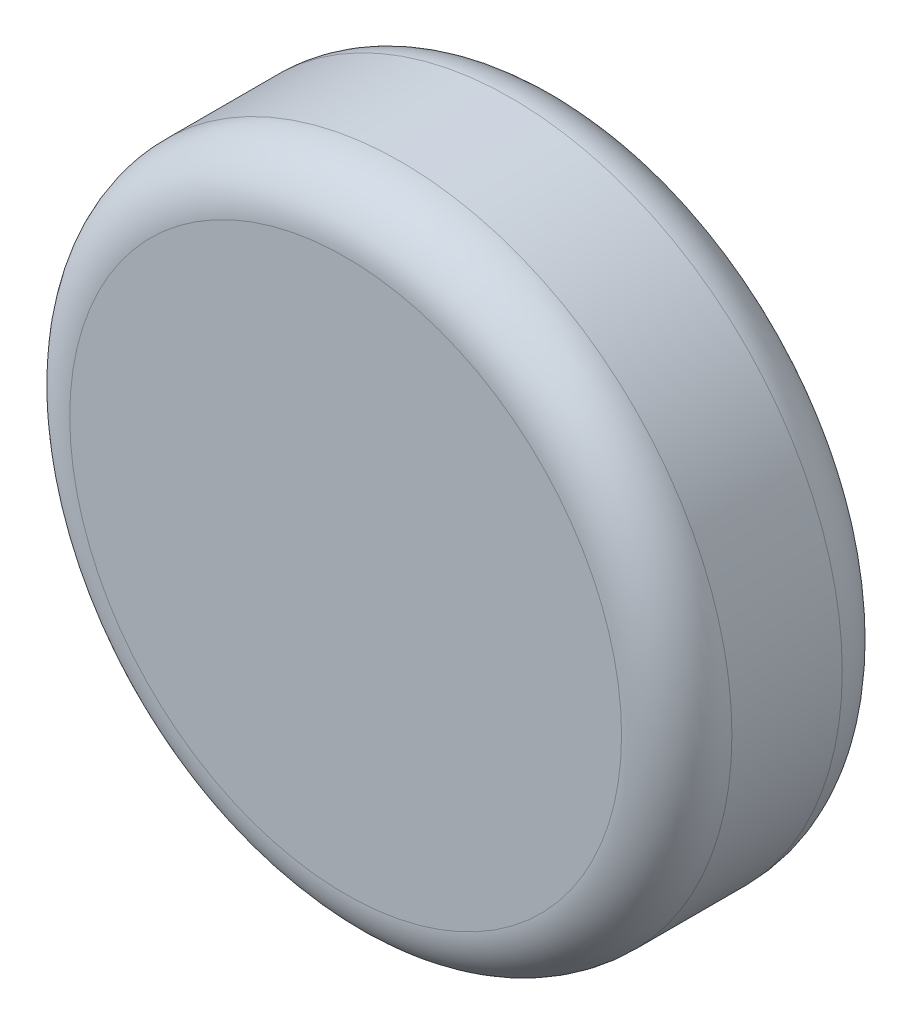
ISO-10303-21;
HEADER;
FILE_DESCRIPTION(('STEP AP214'),'2;1');
FILE_NAME('part.step','',(''),(''),'','','');
FILE_SCHEMA(('AUTOMOTIVE_DESIGN { 1 0 10303 214 1 1 1 1 }'));
ENDSEC;
DATA;
#1=APPLICATION_CONTEXT('core data for automotive mechanical design processes');
#2=APPLICATION_PROTOCOL_DEFINITION('international standard','automotive_design',2000,#1);
#3=PRODUCT_CONTEXT('',#1,'mechanical');
#4=PRODUCT('Part','Part','',(#3));
#5=PRODUCT_RELATED_PRODUCT_CATEGORY('part','',(#4));
#6=PRODUCT_DEFINITION_FORMATION('','',#4);
#7=PRODUCT_DEFINITION_CONTEXT('part definition',#1,'design');
#8=PRODUCT_DEFINITION('design','',#6,#7);
#9=PRODUCT_DEFINITION_SHAPE('','',#8);
#10=(LENGTH_UNIT() NAMED_UNIT(*) SI_UNIT(.MILLI.,.METRE.));
#11=(NAMED_UNIT(*) PLANE_ANGLE_UNIT() SI_UNIT($,.RADIAN.));
#12=(NAMED_UNIT(*) SI_UNIT($,.STERADIAN.) SOLID_ANGLE_UNIT());
#13=UNCERTAINTY_MEASURE_WITH_UNIT(LENGTH_MEASURE(1.E-05),#10,'distance_accuracy_value','');
#14=(GEOMETRIC_REPRESENTATION_CONTEXT(3) GLOBAL_UNCERTAINTY_ASSIGNED_CONTEXT((#13)) GLOBAL_UNIT_ASSIGNED_CONTEXT((#10,
#11,#12)) REPRESENTATION_CONTEXT('',''));
#15=CARTESIAN_POINT('',(0.,0.,0.));
#16=DIRECTION('',(0.,0.,1.));
#17=DIRECTION('',(1.,0.,0.));
#18=AXIS2_PLACEMENT_3D('',#15,#16,#17);
#19=CARTESIAN_POINT('',(0.,0.,2.));
#20=DIRECTION('',(0.,0.,-1.));
#21=DIRECTION('',(-1.,0.,0.));
#22=AXIS2_PLACEMENT_3D('',#19,#20,#21);
#23=CYLINDRICAL_SURFACE('',#22,3.);
#24=CARTESIAN_POINT('',(0.,0.,0.5));
#25=DIRECTION('',(0.,0.,1.));
#26=DIRECTION('',(1.,0.,0.));
#27=AXIS2_PLACEMENT_3D('',#24,#25,#26);
#28=CIRCLE('',#27,3.);
#29=CARTESIAN_POINT('',(3.,0.,0.5));
#30=VERTEX_POINT('',#29);
#31=EDGE_CURVE('E41',#30,#30,#28,.T.);
#32=ORIENTED_EDGE('',*,*,#31,.T.);
#33=EDGE_LOOP('',(#32));
#34=FACE_BOUND('',#33,.T.);
#35=CARTESIAN_POINT('',(0.,0.,1.5));
#36=DIRECTION('',(0.,0.,1.));
#37=DIRECTION('',(1.,0.,0.));
#38=AXIS2_PLACEMENT_3D('',#35,#36,#37);
#39=CIRCLE('',#38,3.);
#40=CARTESIAN_POINT('',(3.,0.,1.5));
#41=VERTEX_POINT('',#40);
#42=EDGE_CURVE('E45',#41,#41,#39,.F.);
#43=ORIENTED_EDGE('',*,*,#42,.T.);
#44=EDGE_LOOP('',(#43));
#45=FACE_BOUND('',#44,.T.);
#46=ADVANCED_FACE('F30',(#34,#45),#23,.T.);
#47=CARTESIAN_POINT('',(0.,0.,2.));
#48=DIRECTION('',(0.,0.,1.));
#49=DIRECTION('',(1.,0.,0.));
#50=AXIS2_PLACEMENT_3D('',#47,#48,#49);
#51=PLANE('',#50);
#52=CARTESIAN_POINT('',(0.,0.,2.));
#53=DIRECTION('',(0.,0.,1.));
#54=DIRECTION('',(1.,0.,0.));
#55=AXIS2_PLACEMENT_3D('',#52,#53,#54);
#56=CIRCLE('',#55,2.5);
#57=CARTESIAN_POINT('',(2.5,0.,2.));
#58=VERTEX_POINT('',#57);
#59=EDGE_CURVE('E10',#58,#58,#56,.T.);
#60=ORIENTED_EDGE('',*,*,#59,.T.);
#61=EDGE_LOOP('',(#60));
#62=FACE_BOUND('',#61,.T.);
#63=ADVANCED_FACE('F61',(#62),#51,.T.);
#64=CARTESIAN_POINT('',(0.,0.,0.));
#65=DIRECTION('',(0.,0.,1.));
#66=DIRECTION('',(1.,0.,0.));
#67=AXIS2_PLACEMENT_3D('',#64,#65,#66);
#68=PLANE('',#67);
#69=CARTESIAN_POINT('',(0.,0.,0.));
#70=DIRECTION('',(0.,0.,1.));
#71=DIRECTION('',(1.,0.,0.));
#72=AXIS2_PLACEMENT_3D('',#69,#70,#71);
#73=CIRCLE('',#72,2.5);
#74=CARTESIAN_POINT('',(2.5,0.,0.));
#75=VERTEX_POINT('',#74);
#76=EDGE_CURVE('E37',#75,#75,#73,.F.);
#77=ORIENTED_EDGE('',*,*,#76,.T.);
#78=EDGE_LOOP('',(#77));
#79=FACE_BOUND('',#78,.T.);
#80=ADVANCED_FACE('F58',(#79),#68,.F.);
#81=CARTESIAN_POINT('',(0.,0.,0.5));
#82=DIRECTION('',(0.,0.,1.));
#83=DIRECTION('',(1.,0.,0.));
#84=AXIS2_PLACEMENT_3D('',#81,#82,#83);
#85=TOROIDAL_SURFACE('',#84,2.5,0.5);
#86=ORIENTED_EDGE('',*,*,#76,.F.);
#87=EDGE_LOOP('',(#86));
#88=FACE_BOUND('',#87,.T.);
#89=ORIENTED_EDGE('',*,*,#31,.F.);
#90=EDGE_LOOP('',(#89));
#91=FACE_BOUND('',#90,.T.);
#92=ADVANCED_FACE('F54',(#88,#91),#85,.T.);
#93=CARTESIAN_POINT('',(0.,0.,1.5));
#94=DIRECTION('',(0.,0.,1.));
#95=DIRECTION('',(1.,0.,0.));
#96=AXIS2_PLACEMENT_3D('',#93,#94,#95);
#97=TOROIDAL_SURFACE('',#96,2.5,0.5);
#98=ORIENTED_EDGE('',*,*,#42,.F.);
#99=EDGE_LOOP('',(#98));
#100=FACE_BOUND('',#99,.T.);
#101=ORIENTED_EDGE('',*,*,#59,.F.);
#102=EDGE_LOOP('',(#101));
#103=FACE_BOUND('',#102,.T.);
#104=ADVANCED_FACE('F32',(#100,#103),#97,.T.);
#105=CLOSED_SHELL('',(#46,#63,#80,#92,#104));
#106=MANIFOLD_SOLID_BREP('B2',#105);
#107=ADVANCED_BREP_SHAPE_REPRESENTATION('',(#18,#106),#14);
#108=SHAPE_DEFINITION_REPRESENTATION(#9,#107);
ENDSEC;
END-ISO-10303-21;
